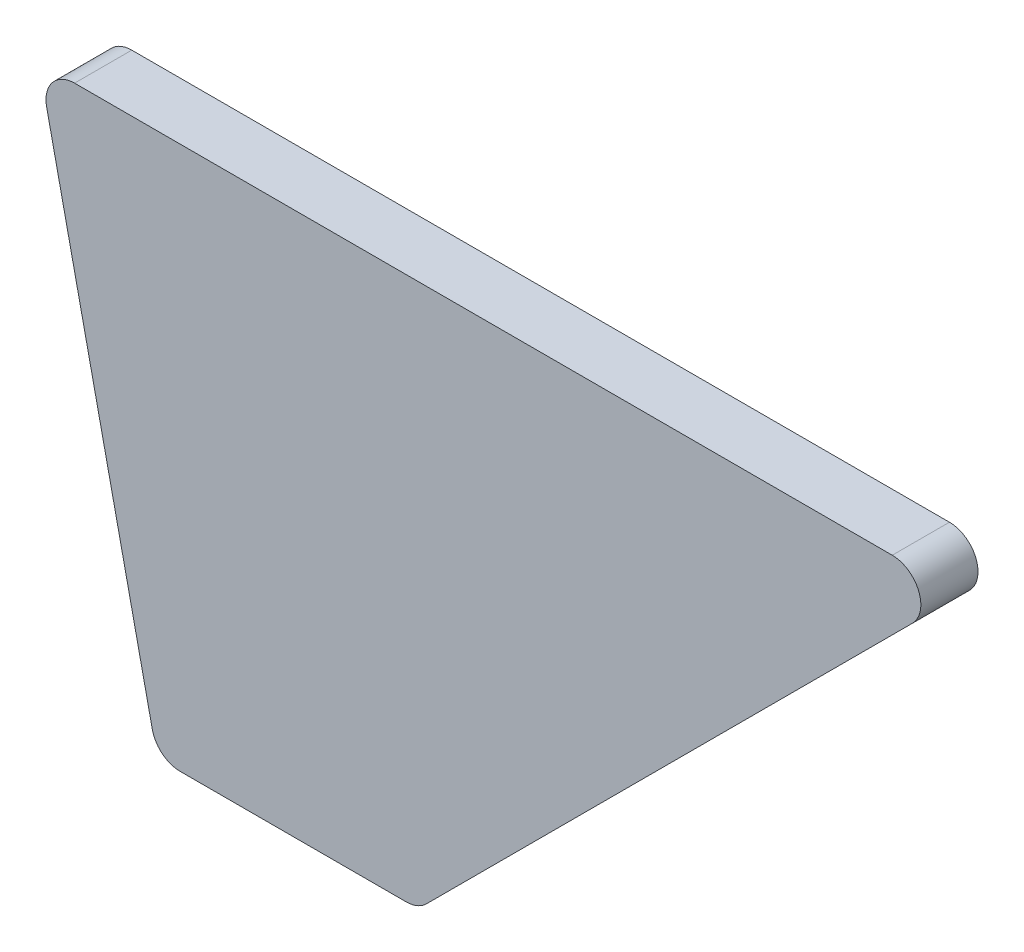
ISO-10303-21;
HEADER;
FILE_DESCRIPTION(('STEP AP214'),'2;1');
FILE_NAME('part.step','',(''),(''),'','','');
FILE_SCHEMA(('AUTOMOTIVE_DESIGN { 1 0 10303 214 1 1 1 1 }'));
ENDSEC;
DATA;
#1=APPLICATION_CONTEXT('core data for automotive mechanical design processes');
#2=APPLICATION_PROTOCOL_DEFINITION('international standard','automotive_design',2000,#1);
#3=PRODUCT_CONTEXT('',#1,'mechanical');
#4=PRODUCT('Part','Part','',(#3));
#5=PRODUCT_RELATED_PRODUCT_CATEGORY('part','',(#4));
#6=PRODUCT_DEFINITION_FORMATION('','',#4);
#7=PRODUCT_DEFINITION_CONTEXT('part definition',#1,'design');
#8=PRODUCT_DEFINITION('design','',#6,#7);
#9=PRODUCT_DEFINITION_SHAPE('','',#8);
#10=(LENGTH_UNIT() NAMED_UNIT(*) SI_UNIT(.MILLI.,.METRE.));
#11=(NAMED_UNIT(*) PLANE_ANGLE_UNIT() SI_UNIT($,.RADIAN.));
#12=(NAMED_UNIT(*) SI_UNIT($,.STERADIAN.) SOLID_ANGLE_UNIT());
#13=UNCERTAINTY_MEASURE_WITH_UNIT(LENGTH_MEASURE(1.E-05),#10,'distance_accuracy_value','');
#14=(GEOMETRIC_REPRESENTATION_CONTEXT(3) GLOBAL_UNCERTAINTY_ASSIGNED_CONTEXT((#13)) GLOBAL_UNIT_ASSIGNED_CONTEXT((#10,
#11,#12)) REPRESENTATION_CONTEXT('',''));
#15=CARTESIAN_POINT('',(0.,0.,0.));
#16=DIRECTION('',(0.,0.,1.));
#17=DIRECTION('',(1.,0.,0.));
#18=AXIS2_PLACEMENT_3D('',#15,#16,#17);
#19=CARTESIAN_POINT('',(7.97922832035548,-155.239034839753,5.));
#20=DIRECTION('',(0.977176363922802,0.21242964433104,0.));
#21=DIRECTION('',(-0.21242964433104,0.977176363922802,0.));
#22=AXIS2_PLACEMENT_3D('',#19,#20,#21);
#23=PLANE('',#22);
#24=DIRECTION('',(0.21242964433104,-0.977176363922802,0.));
#25=VECTOR('',#24,1.);
#26=CARTESIAN_POINT('',(7.97922832035548,-155.239034839753,5.));
#27=LINE('',#26,#25);
#28=CARTESIAN_POINT('',(-11.3550872836322,-66.3011830614075,5.));
#29=VERTEX_POINT('',#28);
#30=CARTESIAN_POINT('',(7.12317358593271,-151.301183061408,5.));
#31=VERTEX_POINT('',#30);
#32=EDGE_CURVE('E119',#29,#31,#27,.T.);
#33=ORIENTED_EDGE('',*,*,#32,.F.);
#34=DIRECTION('',(0.,0.,-1.));
#35=VECTOR('',#34,1.);
#36=CARTESIAN_POINT('',(-11.3550872836322,-66.3011830614075,5.));
#37=LINE('',#36,#35);
#38=CARTESIAN_POINT('',(-11.3550872836322,-66.3011830614075,-5.));
#39=VERTEX_POINT('',#38);
#40=EDGE_CURVE('E104',#29,#39,#37,.T.);
#41=ORIENTED_EDGE('',*,*,#40,.T.);
#42=DIRECTION('',(0.21242964433104,-0.977176363922802,0.));
#43=VECTOR('',#42,1.);
#44=CARTESIAN_POINT('',(7.97922832035548,-155.239034839753,-5.));
#45=LINE('',#44,#43);
#46=CARTESIAN_POINT('',(7.12317358593271,-151.301183061408,-5.));
#47=VERTEX_POINT('',#46);
#48=EDGE_CURVE('E116',#39,#47,#45,.T.);
#49=ORIENTED_EDGE('',*,*,#48,.T.);
#50=DIRECTION('',(0.,0.,-1.));
#51=VECTOR('',#50,1.);
#52=CARTESIAN_POINT('',(7.12317358593271,-151.301183061408,5.));
#53=LINE('',#52,#51);
#54=EDGE_CURVE('E121',#47,#31,#53,.F.);
#55=ORIENTED_EDGE('',*,*,#54,.T.);
#56=EDGE_LOOP('',(#33,#41,#49,#55));
#57=FACE_BOUND('',#56,.T.);
#58=ADVANCED_FACE('F34',(#57),#23,.F.);
#59=CARTESIAN_POINT('',(53.5895871074463,-155.239034839753,5.));
#60=DIRECTION('',(0.,1.,0.));
#61=DIRECTION('',(0.,0.,1.));
#62=AXIS2_PLACEMENT_3D('',#59,#60,#61);
#63=PLANE('',#62);
#64=DIRECTION('',(1.,0.,0.));
#65=VECTOR('',#64,1.);
#66=CARTESIAN_POINT('',(53.5895871074463,-155.239034839753,-5.));
#67=LINE('',#66,#65);
#68=CARTESIAN_POINT('',(12.0090554055467,-155.239034839753,-5.));
#69=VERTEX_POINT('',#68);
#70=CARTESIAN_POINT('',(51.5185192955808,-155.239034839753,-5.));
#71=VERTEX_POINT('',#70);
#72=EDGE_CURVE('E125',#69,#71,#67,.T.);
#73=ORIENTED_EDGE('',*,*,#72,.T.);
#74=DIRECTION('',(0.,0.,-1.));
#75=VECTOR('',#74,1.);
#76=CARTESIAN_POINT('',(51.5185192955808,-155.239034839753,5.));
#77=LINE('',#76,#75);
#78=CARTESIAN_POINT('',(51.5185192955808,-155.239034839753,5.));
#79=VERTEX_POINT('',#78);
#80=EDGE_CURVE('E11',#71,#79,#77,.F.);
#81=ORIENTED_EDGE('',*,*,#80,.T.);
#82=DIRECTION('',(1.,0.,0.));
#83=VECTOR('',#82,1.);
#84=CARTESIAN_POINT('',(53.5895871074463,-155.239034839753,5.));
#85=LINE('',#84,#83);
#86=CARTESIAN_POINT('',(12.0090554055467,-155.239034839753,5.));
#87=VERTEX_POINT('',#86);
#88=EDGE_CURVE('E161',#87,#79,#85,.T.);
#89=ORIENTED_EDGE('',*,*,#88,.F.);
#90=DIRECTION('',(0.,0.,-1.));
#91=VECTOR('',#90,1.);
#92=CARTESIAN_POINT('',(12.0090554055467,-155.239034839753,5.));
#93=LINE('',#92,#91);
#94=EDGE_CURVE('E42',#87,#69,#93,.T.);
#95=ORIENTED_EDGE('',*,*,#94,.T.);
#96=EDGE_LOOP('',(#73,#81,#89,#95));
#97=FACE_BOUND('',#96,.T.);
#98=ADVANCED_FACE('F159',(#97),#63,.F.);
#99=CARTESIAN_POINT('',(148.589587107447,-60.2390348397523,5.));
#100=DIRECTION('',(-0.707106781186548,0.707106781186547,0.));
#101=DIRECTION('',(-0.707106781186547,-0.707106781186548,0.));
#102=AXIS2_PLACEMENT_3D('',#99,#100,#101);
#103=PLANE('',#102);
#104=DIRECTION('',(0.707106781186547,0.707106781186548,0.));
#105=VECTOR('',#104,1.);
#106=CARTESIAN_POINT('',(148.589587107447,-60.2390348397523,-5.));
#107=LINE('',#106,#105);
#108=CARTESIAN_POINT('',(55.0540532015135,-153.774568745685,-5.));
#109=VERTEX_POINT('',#108);
#110=CARTESIAN_POINT('',(140.054053201514,-68.774568745685,-5.));
#111=VERTEX_POINT('',#110);
#112=EDGE_CURVE('E128',#109,#111,#107,.T.);
#113=ORIENTED_EDGE('',*,*,#112,.T.);
#114=DIRECTION('',(0.,0.,-1.));
#115=VECTOR('',#114,1.);
#116=CARTESIAN_POINT('',(140.054053201514,-68.774568745685,5.));
#117=LINE('',#116,#115);
#118=CARTESIAN_POINT('',(140.054053201514,-68.774568745685,5.));
#119=VERTEX_POINT('',#118);
#120=EDGE_CURVE('E49',#111,#119,#117,.F.);
#121=ORIENTED_EDGE('',*,*,#120,.T.);
#122=DIRECTION('',(0.707106781186547,0.707106781186548,0.));
#123=VECTOR('',#122,1.);
#124=CARTESIAN_POINT('',(148.589587107447,-60.2390348397523,5.));
#125=LINE('',#124,#123);
#126=CARTESIAN_POINT('',(55.0540532015135,-153.774568745685,5.));
#127=VERTEX_POINT('',#126);
#128=EDGE_CURVE('E169',#127,#119,#125,.T.);
#129=ORIENTED_EDGE('',*,*,#128,.F.);
#130=DIRECTION('',(0.,0.,-1.));
#131=VECTOR('',#130,1.);
#132=CARTESIAN_POINT('',(55.0540532015135,-153.774568745685,5.));
#133=LINE('',#132,#131);
#134=EDGE_CURVE('E152',#127,#109,#133,.T.);
#135=ORIENTED_EDGE('',*,*,#134,.T.);
#136=EDGE_LOOP('',(#113,#121,#129,#135));
#137=FACE_BOUND('',#136,.T.);
#138=ADVANCED_FACE('F168',(#137),#103,.F.);
#139=CARTESIAN_POINT('',(-12.6729455926877,-60.2390348397523,5.));
#140=DIRECTION('',(0.,-1.,0.));
#141=DIRECTION('',(1.,0.,0.));
#142=AXIS2_PLACEMENT_3D('',#139,#140,#141);
#143=PLANE('',#142);
#144=DIRECTION('',(-1.,0.,0.));
#145=VECTOR('',#144,1.);
#146=CARTESIAN_POINT('',(-12.6729455926877,-60.2390348397523,-5.));
#147=LINE('',#146,#145);
#148=CARTESIAN_POINT('',(136.518519295581,-60.2390348397523,-5.));
#149=VERTEX_POINT('',#148);
#150=CARTESIAN_POINT('',(-6.46920546401819,-60.2390348397523,-5.));
#151=VERTEX_POINT('',#150);
#152=EDGE_CURVE('E135',#149,#151,#147,.T.);
#153=ORIENTED_EDGE('',*,*,#152,.T.);
#154=DIRECTION('',(0.,0.,-1.));
#155=VECTOR('',#154,1.);
#156=CARTESIAN_POINT('',(-6.46920546401819,-60.2390348397523,5.));
#157=LINE('',#156,#155);
#158=CARTESIAN_POINT('',(-6.46920546401819,-60.2390348397523,5.));
#159=VERTEX_POINT('',#158);
#160=EDGE_CURVE('E105',#151,#159,#157,.F.);
#161=ORIENTED_EDGE('',*,*,#160,.T.);
#162=DIRECTION('',(-1.,0.,0.));
#163=VECTOR('',#162,1.);
#164=CARTESIAN_POINT('',(-12.6729455926877,-60.2390348397523,5.));
#165=LINE('',#164,#163);
#166=CARTESIAN_POINT('',(136.518519295581,-60.2390348397523,5.));
#167=VERTEX_POINT('',#166);
#168=EDGE_CURVE('E131',#167,#159,#165,.T.);
#169=ORIENTED_EDGE('',*,*,#168,.F.);
#170=DIRECTION('',(0.,0.,-1.));
#171=VECTOR('',#170,1.);
#172=CARTESIAN_POINT('',(136.518519295581,-60.2390348397523,5.));
#173=LINE('',#172,#171);
#174=EDGE_CURVE('E110',#167,#149,#173,.T.);
#175=ORIENTED_EDGE('',*,*,#174,.T.);
#176=EDGE_LOOP('',(#153,#161,#169,#175));
#177=FACE_BOUND('',#176,.T.);
#178=ADVANCED_FACE('F197',(#177),#143,.F.);
#179=CARTESIAN_POINT('',(0.,0.,5.));
#180=DIRECTION('',(0.,0.,-1.));
#181=DIRECTION('',(-1.,0.,0.));
#182=AXIS2_PLACEMENT_3D('',#179,#180,#181);
#183=PLANE('',#182);
#184=ORIENTED_EDGE('',*,*,#168,.T.);
#185=CARTESIAN_POINT('',(-6.46920546401819,-65.2390348397523,5.));
#186=DIRECTION('',(0.,0.,-1.));
#187=DIRECTION('',(-1.,0.,0.));
#188=AXIS2_PLACEMENT_3D('',#185,#186,#187);
#189=CIRCLE('',#188,5.);
#190=EDGE_CURVE('E150',#159,#29,#189,.F.);
#191=ORIENTED_EDGE('',*,*,#190,.T.);
#192=ORIENTED_EDGE('',*,*,#32,.T.);
#193=CARTESIAN_POINT('',(12.0090554055467,-150.239034839753,5.));
#194=DIRECTION('',(0.,0.,-1.));
#195=DIRECTION('',(-1.,0.,0.));
#196=AXIS2_PLACEMENT_3D('',#193,#194,#195);
#197=CIRCLE('',#196,5.);
#198=EDGE_CURVE('E145',#31,#87,#197,.F.);
#199=ORIENTED_EDGE('',*,*,#198,.T.);
#200=ORIENTED_EDGE('',*,*,#88,.T.);
#201=CARTESIAN_POINT('',(51.5185192955808,-150.239034839753,5.));
#202=DIRECTION('',(0.,0.,-1.));
#203=DIRECTION('',(-1.,0.,0.));
#204=AXIS2_PLACEMENT_3D('',#201,#202,#203);
#205=CIRCLE('',#204,5.);
#206=EDGE_CURVE('E56',#79,#127,#205,.F.);
#207=ORIENTED_EDGE('',*,*,#206,.T.);
#208=ORIENTED_EDGE('',*,*,#128,.T.);
#209=CARTESIAN_POINT('',(136.518519295581,-65.2390348397523,5.));
#210=DIRECTION('',(0.,0.,-1.));
#211=DIRECTION('',(-1.,0.,0.));
#212=AXIS2_PLACEMENT_3D('',#209,#210,#211);
#213=CIRCLE('',#212,5.);
#214=EDGE_CURVE('E148',#119,#167,#213,.F.);
#215=ORIENTED_EDGE('',*,*,#214,.T.);
#216=EDGE_LOOP('',(#184,#191,#192,#199,#200,#207,#208,#215));
#217=FACE_BOUND('',#216,.T.);
#218=ADVANCED_FACE('F174',(#217),#183,.F.);
#219=CARTESIAN_POINT('',(0.,0.,-5.));
#220=DIRECTION('',(0.,0.,-1.));
#221=DIRECTION('',(-1.,0.,0.));
#222=AXIS2_PLACEMENT_3D('',#219,#220,#221);
#223=PLANE('',#222);
#224=ORIENTED_EDGE('',*,*,#48,.F.);
#225=CARTESIAN_POINT('',(-6.46920546401819,-65.2390348397523,-5.));
#226=DIRECTION('',(0.,0.,-1.));
#227=DIRECTION('',(-1.,0.,0.));
#228=AXIS2_PLACEMENT_3D('',#225,#226,#227);
#229=CIRCLE('',#228,5.);
#230=EDGE_CURVE('E100',#39,#151,#229,.T.);
#231=ORIENTED_EDGE('',*,*,#230,.T.);
#232=ORIENTED_EDGE('',*,*,#152,.F.);
#233=CARTESIAN_POINT('',(136.518519295581,-65.2390348397523,-5.));
#234=DIRECTION('',(0.,0.,-1.));
#235=DIRECTION('',(-1.,0.,0.));
#236=AXIS2_PLACEMENT_3D('',#233,#234,#235);
#237=CIRCLE('',#236,5.);
#238=EDGE_CURVE('E111',#149,#111,#237,.T.);
#239=ORIENTED_EDGE('',*,*,#238,.T.);
#240=ORIENTED_EDGE('',*,*,#112,.F.);
#241=CARTESIAN_POINT('',(51.5185192955808,-150.239034839753,-5.));
#242=DIRECTION('',(0.,0.,-1.));
#243=DIRECTION('',(-1.,0.,0.));
#244=AXIS2_PLACEMENT_3D('',#241,#242,#243);
#245=CIRCLE('',#244,5.);
#246=EDGE_CURVE('E139',#109,#71,#245,.T.);
#247=ORIENTED_EDGE('',*,*,#246,.T.);
#248=ORIENTED_EDGE('',*,*,#72,.F.);
#249=CARTESIAN_POINT('',(12.0090554055467,-150.239034839753,-5.));
#250=DIRECTION('',(0.,0.,-1.));
#251=DIRECTION('',(-1.,0.,0.));
#252=AXIS2_PLACEMENT_3D('',#249,#250,#251);
#253=CIRCLE('',#252,5.);
#254=EDGE_CURVE('E120',#69,#47,#253,.T.);
#255=ORIENTED_EDGE('',*,*,#254,.T.);
#256=EDGE_LOOP('',(#224,#231,#232,#239,#240,#247,#248,#255));
#257=FACE_BOUND('',#256,.T.);
#258=ADVANCED_FACE('F123',(#257),#223,.T.);
#259=CARTESIAN_POINT('',(-6.46920546401819,-65.2390348397523,5.));
#260=DIRECTION('',(0.,0.,-1.));
#261=DIRECTION('',(-1.,0.,0.));
#262=AXIS2_PLACEMENT_3D('',#259,#260,#261);
#263=CYLINDRICAL_SURFACE('',#262,5.);
#264=ORIENTED_EDGE('',*,*,#190,.F.);
#265=ORIENTED_EDGE('',*,*,#160,.F.);
#266=ORIENTED_EDGE('',*,*,#230,.F.);
#267=ORIENTED_EDGE('',*,*,#40,.F.);
#268=EDGE_LOOP('',(#264,#265,#266,#267));
#269=FACE_BOUND('',#268,.T.);
#270=ADVANCED_FACE('F103',(#269),#263,.T.);
#271=CARTESIAN_POINT('',(136.518519295581,-65.2390348397523,5.));
#272=DIRECTION('',(0.,0.,-1.));
#273=DIRECTION('',(-1.,0.,0.));
#274=AXIS2_PLACEMENT_3D('',#271,#272,#273);
#275=CYLINDRICAL_SURFACE('',#274,5.);
#276=ORIENTED_EDGE('',*,*,#214,.F.);
#277=ORIENTED_EDGE('',*,*,#120,.F.);
#278=ORIENTED_EDGE('',*,*,#238,.F.);
#279=ORIENTED_EDGE('',*,*,#174,.F.);
#280=EDGE_LOOP('',(#276,#277,#278,#279));
#281=FACE_BOUND('',#280,.T.);
#282=ADVANCED_FACE('F179',(#281),#275,.T.);
#283=CARTESIAN_POINT('',(51.5185192955808,-150.239034839753,5.));
#284=DIRECTION('',(0.,0.,-1.));
#285=DIRECTION('',(-1.,0.,0.));
#286=AXIS2_PLACEMENT_3D('',#283,#284,#285);
#287=CYLINDRICAL_SURFACE('',#286,5.);
#288=ORIENTED_EDGE('',*,*,#206,.F.);
#289=ORIENTED_EDGE('',*,*,#80,.F.);
#290=ORIENTED_EDGE('',*,*,#246,.F.);
#291=ORIENTED_EDGE('',*,*,#134,.F.);
#292=EDGE_LOOP('',(#288,#289,#290,#291));
#293=FACE_BOUND('',#292,.T.);
#294=ADVANCED_FACE('F167',(#293),#287,.T.);
#295=CARTESIAN_POINT('',(12.0090554055467,-150.239034839753,5.));
#296=DIRECTION('',(0.,0.,-1.));
#297=DIRECTION('',(-1.,0.,0.));
#298=AXIS2_PLACEMENT_3D('',#295,#296,#297);
#299=CYLINDRICAL_SURFACE('',#298,5.);
#300=ORIENTED_EDGE('',*,*,#198,.F.);
#301=ORIENTED_EDGE('',*,*,#54,.F.);
#302=ORIENTED_EDGE('',*,*,#254,.F.);
#303=ORIENTED_EDGE('',*,*,#94,.F.);
#304=EDGE_LOOP('',(#300,#301,#302,#303));
#305=FACE_BOUND('',#304,.T.);
#306=ADVANCED_FACE('F36',(#305),#299,.T.);
#307=CLOSED_SHELL('',(#58,#98,#138,#178,#218,#258,#270,#282,#294,#306));
#308=MANIFOLD_SOLID_BREP('B2',#307);
#309=ADVANCED_BREP_SHAPE_REPRESENTATION('',(#18,#308),#14);
#310=SHAPE_DEFINITION_REPRESENTATION(#9,#309);
ENDSEC;
END-ISO-10303-21;
